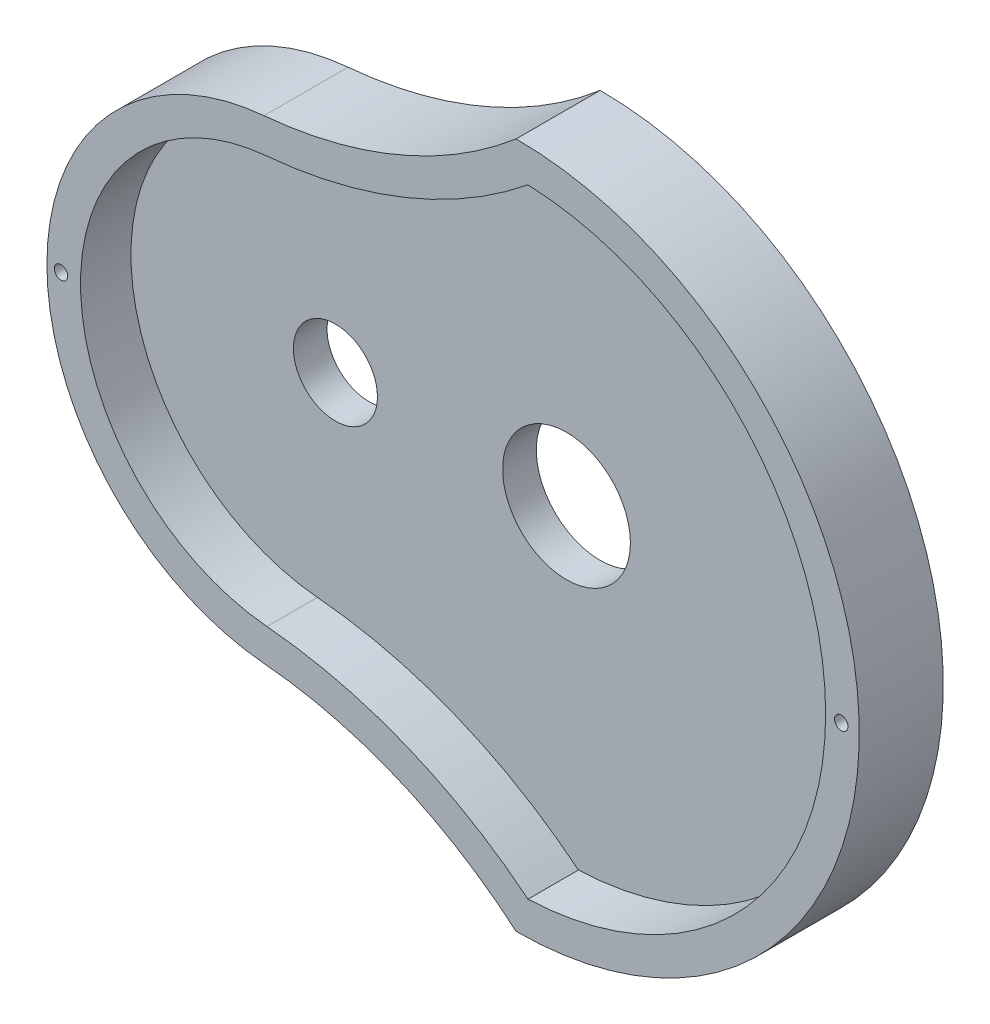
ISO-10303-21;
HEADER;
FILE_DESCRIPTION(('STEP AP214'),'2;1');
FILE_NAME('part.step','',(''),(''),'','','');
FILE_SCHEMA(('AUTOMOTIVE_DESIGN { 1 0 10303 214 1 1 1 1 }'));
ENDSEC;
DATA;
#1=APPLICATION_CONTEXT('core data for automotive mechanical design processes');
#2=APPLICATION_PROTOCOL_DEFINITION('international standard','automotive_design',2000,#1);
#3=PRODUCT_CONTEXT('',#1,'mechanical');
#4=PRODUCT('Part','Part','',(#3));
#5=PRODUCT_RELATED_PRODUCT_CATEGORY('part','',(#4));
#6=PRODUCT_DEFINITION_FORMATION('','',#4);
#7=PRODUCT_DEFINITION_CONTEXT('part definition',#1,'design');
#8=PRODUCT_DEFINITION('design','',#6,#7);
#9=PRODUCT_DEFINITION_SHAPE('','',#8);
#10=(LENGTH_UNIT() NAMED_UNIT(*) SI_UNIT(.MILLI.,.METRE.));
#11=(NAMED_UNIT(*) PLANE_ANGLE_UNIT() SI_UNIT($,.RADIAN.));
#12=(NAMED_UNIT(*) SI_UNIT($,.STERADIAN.) SOLID_ANGLE_UNIT());
#13=UNCERTAINTY_MEASURE_WITH_UNIT(LENGTH_MEASURE(1.E-05),#10,'distance_accuracy_value','');
#14=(GEOMETRIC_REPRESENTATION_CONTEXT(3) GLOBAL_UNCERTAINTY_ASSIGNED_CONTEXT((#13)) GLOBAL_UNIT_ASSIGNED_CONTEXT((#10,
#11,#12)) REPRESENTATION_CONTEXT('',''));
#15=CARTESIAN_POINT('',(0.,0.,0.));
#16=DIRECTION('',(0.,0.,1.));
#17=DIRECTION('',(1.,0.,0.));
#18=AXIS2_PLACEMENT_3D('',#15,#16,#17);
#19=CARTESIAN_POINT('',(-22.0423938438775,51.704240700986,6.35));
#20=DIRECTION('',(0.,0.,-1.));
#21=DIRECTION('',(-1.,0.,0.));
#22=AXIS2_PLACEMENT_3D('',#19,#20,#21);
#23=CYLINDRICAL_SURFACE('',#22,33.9145948689712);
#24=CARTESIAN_POINT('',(-22.0423938438775,51.704240700986,0.));
#25=DIRECTION('',(0.,0.,-1.));
#26=DIRECTION('',(1.,0.,0.));
#27=AXIS2_PLACEMENT_3D('',#24,#25,#26);
#28=CIRCLE('',#27,33.9145948689712);
#29=CARTESIAN_POINT('',(0.,25.92959,0.));
#30=VERTEX_POINT('',#29);
#31=CARTESIAN_POINT('',(-19.05,17.9219180423888,0.));
#32=VERTEX_POINT('',#31);
#33=EDGE_CURVE('E160',#30,#32,#28,.T.);
#34=ORIENTED_EDGE('',*,*,#33,.T.);
#35=DIRECTION('',(0.,0.,-1.));
#36=VECTOR('',#35,1.);
#37=CARTESIAN_POINT('',(-19.05,17.9219180423888,6.35));
#38=LINE('',#37,#36);
#39=CARTESIAN_POINT('',(-19.05,17.9219180423888,6.35));
#40=VERTEX_POINT('',#39);
#41=EDGE_CURVE('E11',#40,#32,#38,.T.);
#42=ORIENTED_EDGE('',*,*,#41,.F.);
#43=CARTESIAN_POINT('',(-22.0423938438775,51.704240700986,6.35));
#44=DIRECTION('',(0.,0.,-1.));
#45=DIRECTION('',(1.,0.,0.));
#46=AXIS2_PLACEMENT_3D('',#43,#44,#45);
#47=CIRCLE('',#46,33.9145948689712);
#48=CARTESIAN_POINT('',(0.,25.92959,6.35));
#49=VERTEX_POINT('',#48);
#50=EDGE_CURVE('E147',#49,#40,#47,.T.);
#51=ORIENTED_EDGE('',*,*,#50,.F.);
#52=DIRECTION('',(0.,0.,-1.));
#53=VECTOR('',#52,1.);
#54=CARTESIAN_POINT('',(0.,25.92959,6.35));
#55=LINE('',#54,#53);
#56=EDGE_CURVE('E156',#49,#30,#55,.T.);
#57=ORIENTED_EDGE('',*,*,#56,.T.);
#58=EDGE_LOOP('',(#34,#42,#51,#57));
#59=FACE_BOUND('',#58,.T.);
#60=ADVANCED_FACE('F43',(#59),#23,.F.);
#61=CARTESIAN_POINT('',(-17.4625,0.,6.35));
#62=DIRECTION('',(0.,0.,-1.));
#63=DIRECTION('',(-1.,0.,0.));
#64=AXIS2_PLACEMENT_3D('',#61,#62,#63);
#65=CYLINDRICAL_SURFACE('',#64,17.99209);
#66=CARTESIAN_POINT('',(-17.4625,0.,0.));
#67=DIRECTION('',(0.,0.,1.));
#68=DIRECTION('',(1.,0.,0.));
#69=AXIS2_PLACEMENT_3D('',#66,#67,#68);
#70=CIRCLE('',#69,17.99209);
#71=CARTESIAN_POINT('',(-19.05,-17.9219180423888,0.));
#72=VERTEX_POINT('',#71);
#73=EDGE_CURVE('E159',#32,#72,#70,.T.);
#74=ORIENTED_EDGE('',*,*,#73,.T.);
#75=DIRECTION('',(0.,0.,-1.));
#76=VECTOR('',#75,1.);
#77=CARTESIAN_POINT('',(-19.05,-17.9219180423888,6.35));
#78=LINE('',#77,#76);
#79=CARTESIAN_POINT('',(-19.05,-17.9219180423888,6.35));
#80=VERTEX_POINT('',#79);
#81=EDGE_CURVE('E49',#80,#72,#78,.T.);
#82=ORIENTED_EDGE('',*,*,#81,.F.);
#83=CARTESIAN_POINT('',(-17.4625,0.,6.35));
#84=DIRECTION('',(0.,0.,1.));
#85=DIRECTION('',(1.,0.,0.));
#86=AXIS2_PLACEMENT_3D('',#83,#84,#85);
#87=CIRCLE('',#86,17.99209);
#88=EDGE_CURVE('E94',#40,#80,#87,.T.);
#89=ORIENTED_EDGE('',*,*,#88,.F.);
#90=ORIENTED_EDGE('',*,*,#41,.T.);
#91=EDGE_LOOP('',(#74,#82,#89,#90));
#92=FACE_BOUND('',#91,.T.);
#93=ADVANCED_FACE('F189',(#92),#65,.T.);
#94=CARTESIAN_POINT('',(-22.0423938438776,-51.7042407009861,6.35));
#95=DIRECTION('',(0.,0.,-1.));
#96=DIRECTION('',(-1.,0.,0.));
#97=AXIS2_PLACEMENT_3D('',#94,#95,#96);
#98=CYLINDRICAL_SURFACE('',#97,33.9145948689713);
#99=CARTESIAN_POINT('',(-22.0423938438776,-51.7042407009861,0.));
#100=DIRECTION('',(0.,0.,-1.));
#101=DIRECTION('',(-1.,0.,0.));
#102=AXIS2_PLACEMENT_3D('',#99,#100,#101);
#103=CIRCLE('',#102,33.9145948689713);
#104=CARTESIAN_POINT('',(0.,-25.92959,0.));
#105=VERTEX_POINT('',#104);
#106=EDGE_CURVE('E165',#72,#105,#103,.T.);
#107=ORIENTED_EDGE('',*,*,#106,.T.);
#108=DIRECTION('',(0.,0.,-1.));
#109=VECTOR('',#108,1.);
#110=CARTESIAN_POINT('',(0.,-25.92959,6.35));
#111=LINE('',#110,#109);
#112=CARTESIAN_POINT('',(0.,-25.92959,6.35));
#113=VERTEX_POINT('',#112);
#114=EDGE_CURVE('E167',#113,#105,#111,.T.);
#115=ORIENTED_EDGE('',*,*,#114,.F.);
#116=CARTESIAN_POINT('',(-22.0423938438776,-51.7042407009861,6.35));
#117=DIRECTION('',(0.,0.,-1.));
#118=DIRECTION('',(-1.,0.,0.));
#119=AXIS2_PLACEMENT_3D('',#116,#117,#118);
#120=CIRCLE('',#119,33.9145948689713);
#121=EDGE_CURVE('E153',#80,#113,#120,.T.);
#122=ORIENTED_EDGE('',*,*,#121,.F.);
#123=ORIENTED_EDGE('',*,*,#81,.T.);
#124=EDGE_LOOP('',(#107,#115,#122,#123));
#125=FACE_BOUND('',#124,.T.);
#126=ADVANCED_FACE('F173',(#125),#98,.F.);
#127=CARTESIAN_POINT('',(0.,0.,6.35));
#128=DIRECTION('',(0.,0.,-1.));
#129=DIRECTION('',(-1.,0.,0.));
#130=AXIS2_PLACEMENT_3D('',#127,#128,#129);
#131=CYLINDRICAL_SURFACE('',#130,25.92959);
#132=CARTESIAN_POINT('',(0.,0.,0.));
#133=DIRECTION('',(0.,0.,1.));
#134=DIRECTION('',(1.,0.,0.));
#135=AXIS2_PLACEMENT_3D('',#132,#133,#134);
#136=CIRCLE('',#135,25.92959);
#137=EDGE_CURVE('E87',#105,#30,#136,.T.);
#138=ORIENTED_EDGE('',*,*,#137,.T.);
#139=ORIENTED_EDGE('',*,*,#56,.F.);
#140=CARTESIAN_POINT('',(0.,0.,6.35));
#141=DIRECTION('',(0.,0.,1.));
#142=DIRECTION('',(1.,0.,0.));
#143=AXIS2_PLACEMENT_3D('',#140,#141,#142);
#144=CIRCLE('',#143,25.92959);
#145=EDGE_CURVE('E68',#113,#49,#144,.T.);
#146=ORIENTED_EDGE('',*,*,#145,.F.);
#147=ORIENTED_EDGE('',*,*,#114,.T.);
#148=EDGE_LOOP('',(#138,#139,#146,#147));
#149=FACE_BOUND('',#148,.T.);
#150=ADVANCED_FACE('F179',(#149),#131,.T.);
#151=CARTESIAN_POINT('',(-11.0211969219388,25.852120350493,6.35));
#152=DIRECTION('',(0.,0.,1.));
#153=DIRECTION('',(1.,0.,0.));
#154=AXIS2_PLACEMENT_3D('',#151,#152,#153);
#155=PLANE('',#154);
#156=CARTESIAN_POINT('',(-34.3926840398212,0.,6.35));
#157=DIRECTION('',(0.,0.,1.));
#158=DIRECTION('',(1.,0.,0.));
#159=AXIS2_PLACEMENT_3D('',#156,#157,#158);
#160=CIRCLE('',#159,0.508000000000002);
#161=CARTESIAN_POINT('',(-33.8846840398212,0.,6.35));
#162=VERTEX_POINT('',#161);
#163=EDGE_CURVE('E334',#162,#162,#160,.T.);
#164=ORIENTED_EDGE('',*,*,#163,.F.);
#165=EDGE_LOOP('',(#164));
#166=FACE_BOUND('',#165,.T.);
#167=CARTESIAN_POINT('',(24.5691431426945,0.,6.35));
#168=DIRECTION('',(0.,0.,1.));
#169=DIRECTION('',(1.,0.,0.));
#170=AXIS2_PLACEMENT_3D('',#167,#168,#169);
#171=CIRCLE('',#170,0.508000000000002);
#172=CARTESIAN_POINT('',(25.0771431426945,0.,6.35));
#173=VERTEX_POINT('',#172);
#174=EDGE_CURVE('E337',#173,#173,#171,.T.);
#175=ORIENTED_EDGE('',*,*,#174,.F.);
#176=EDGE_LOOP('',(#175));
#177=FACE_BOUND('',#176,.T.);
#178=CARTESIAN_POINT('',(-22.0423938438775,51.704240700986,6.35));
#179=DIRECTION('',(0.,0.,1.));
#180=DIRECTION('',(1.,0.,0.));
#181=AXIS2_PLACEMENT_3D('',#178,#179,#180);
#182=CIRCLE('',#181,36.4545948689712);
#183=CARTESIAN_POINT('',(0.897573632694142,23.3723614969047,6.35));
#184=VERTEX_POINT('',#183);
#185=CARTESIAN_POINT('',(-18.8258876261735,15.3918244386069,6.35));
#186=VERTEX_POINT('',#185);
#187=EDGE_CURVE('E139',#184,#186,#182,.F.);
#188=ORIENTED_EDGE('',*,*,#187,.F.);
#189=CARTESIAN_POINT('',(0.,0.,6.35));
#190=DIRECTION('',(0.,0.,1.));
#191=DIRECTION('',(1.,0.,0.));
#192=AXIS2_PLACEMENT_3D('',#189,#190,#191);
#193=CIRCLE('',#192,23.38959);
#194=CARTESIAN_POINT('',(0.897573632694144,-23.3723614969047,6.35));
#195=VERTEX_POINT('',#194);
#196=EDGE_CURVE('E146',#195,#184,#193,.T.);
#197=ORIENTED_EDGE('',*,*,#196,.F.);
#198=CARTESIAN_POINT('',(-22.0423938438776,-51.7042407009861,6.35));
#199=DIRECTION('',(0.,0.,1.));
#200=DIRECTION('',(1.,0.,0.));
#201=AXIS2_PLACEMENT_3D('',#198,#199,#200);
#202=CIRCLE('',#201,36.4545948689713);
#203=CARTESIAN_POINT('',(-18.8258876261735,-15.3918244386069,6.35));
#204=VERTEX_POINT('',#203);
#205=EDGE_CURVE('E148',#204,#195,#202,.F.);
#206=ORIENTED_EDGE('',*,*,#205,.F.);
#207=CARTESIAN_POINT('',(-17.4625,0.,6.35));
#208=DIRECTION('',(0.,0.,1.));
#209=DIRECTION('',(1.,0.,0.));
#210=AXIS2_PLACEMENT_3D('',#207,#208,#209);
#211=CIRCLE('',#210,15.45209);
#212=EDGE_CURVE('E133',#186,#204,#211,.T.);
#213=ORIENTED_EDGE('',*,*,#212,.F.);
#214=EDGE_LOOP('',(#188,#197,#206,#213));
#215=FACE_BOUND('',#214,.T.);
#216=ORIENTED_EDGE('',*,*,#50,.T.);
#217=ORIENTED_EDGE('',*,*,#88,.T.);
#218=ORIENTED_EDGE('',*,*,#121,.T.);
#219=ORIENTED_EDGE('',*,*,#145,.T.);
#220=EDGE_LOOP('',(#216,#217,#218,#219));
#221=FACE_BOUND('',#220,.T.);
#222=ADVANCED_FACE('F182',(#166,#177,#215,#221),#155,.T.);
#223=CARTESIAN_POINT('',(-11.0211969219388,25.852120350493,0.));
#224=DIRECTION('',(0.,0.,1.));
#225=DIRECTION('',(1.,0.,0.));
#226=AXIS2_PLACEMENT_3D('',#223,#224,#225);
#227=PLANE('',#226);
#228=CARTESIAN_POINT('',(0.,0.,0.));
#229=DIRECTION('',(0.,0.,1.));
#230=DIRECTION('',(1.,0.,0.));
#231=AXIS2_PLACEMENT_3D('',#228,#229,#230);
#232=CIRCLE('',#231,4.826);
#233=CARTESIAN_POINT('',(4.826,0.,0.));
#234=VERTEX_POINT('',#233);
#235=EDGE_CURVE('E348',#234,#234,#232,.F.);
#236=ORIENTED_EDGE('',*,*,#235,.F.);
#237=EDGE_LOOP('',(#236));
#238=FACE_BOUND('',#237,.T.);
#239=CARTESIAN_POINT('',(-17.4625,0.,0.));
#240=DIRECTION('',(0.,0.,1.));
#241=DIRECTION('',(1.,0.,0.));
#242=AXIS2_PLACEMENT_3D('',#239,#240,#241);
#243=CIRCLE('',#242,3.175);
#244=CARTESIAN_POINT('',(-14.2875,0.,0.));
#245=VERTEX_POINT('',#244);
#246=EDGE_CURVE('E335',#245,#245,#243,.F.);
#247=ORIENTED_EDGE('',*,*,#246,.F.);
#248=EDGE_LOOP('',(#247));
#249=FACE_BOUND('',#248,.T.);
#250=ORIENTED_EDGE('',*,*,#33,.F.);
#251=ORIENTED_EDGE('',*,*,#137,.F.);
#252=ORIENTED_EDGE('',*,*,#106,.F.);
#253=ORIENTED_EDGE('',*,*,#73,.F.);
#254=EDGE_LOOP('',(#250,#251,#252,#253));
#255=FACE_BOUND('',#254,.T.);
#256=ADVANCED_FACE('F174',(#238,#249,#255),#227,.F.);
#257=CARTESIAN_POINT('',(-22.0423938438775,51.704240700986,6.35));
#258=DIRECTION('',(0.,0.,-1.));
#259=DIRECTION('',(-1.,0.,0.));
#260=AXIS2_PLACEMENT_3D('',#257,#258,#259);
#261=CYLINDRICAL_SURFACE('',#260,36.4545948689712);
#262=CARTESIAN_POINT('',(-22.0423938438775,51.704240700986,2.54));
#263=DIRECTION('',(0.,0.,1.));
#264=DIRECTION('',(1.,0.,0.));
#265=AXIS2_PLACEMENT_3D('',#262,#263,#264);
#266=CIRCLE('',#265,36.4545948689712);
#267=CARTESIAN_POINT('',(0.897573632694142,23.3723614969047,2.54));
#268=VERTEX_POINT('',#267);
#269=CARTESIAN_POINT('',(-18.8258876261735,15.3918244386069,2.54));
#270=VERTEX_POINT('',#269);
#271=EDGE_CURVE('E125',#268,#270,#266,.F.);
#272=ORIENTED_EDGE('',*,*,#271,.F.);
#273=DIRECTION('',(0.,0.,-1.));
#274=VECTOR('',#273,1.);
#275=CARTESIAN_POINT('',(0.897573632694142,23.3723614969047,6.35));
#276=LINE('',#275,#274);
#277=EDGE_CURVE('E142',#184,#268,#276,.T.);
#278=ORIENTED_EDGE('',*,*,#277,.F.);
#279=ORIENTED_EDGE('',*,*,#187,.T.);
#280=DIRECTION('',(0.,0.,-1.));
#281=VECTOR('',#280,1.);
#282=CARTESIAN_POINT('',(-18.8258876261735,15.3918244386069,6.35));
#283=LINE('',#282,#281);
#284=EDGE_CURVE('E132',#186,#270,#283,.T.);
#285=ORIENTED_EDGE('',*,*,#284,.T.);
#286=EDGE_LOOP('',(#272,#278,#279,#285));
#287=FACE_BOUND('',#286,.T.);
#288=ADVANCED_FACE('F228',(#287),#261,.T.);
#289=CARTESIAN_POINT('',(-17.4625,0.,6.35));
#290=DIRECTION('',(0.,0.,-1.));
#291=DIRECTION('',(-1.,0.,0.));
#292=AXIS2_PLACEMENT_3D('',#289,#290,#291);
#293=CYLINDRICAL_SURFACE('',#292,15.45209);
#294=CARTESIAN_POINT('',(-17.4625,0.,2.54));
#295=DIRECTION('',(0.,0.,1.));
#296=DIRECTION('',(1.,0.,0.));
#297=AXIS2_PLACEMENT_3D('',#294,#295,#296);
#298=CIRCLE('',#297,15.45209);
#299=CARTESIAN_POINT('',(-18.8258876261735,-15.3918244386069,2.54));
#300=VERTEX_POINT('',#299);
#301=EDGE_CURVE('E118',#270,#300,#298,.T.);
#302=ORIENTED_EDGE('',*,*,#301,.F.);
#303=ORIENTED_EDGE('',*,*,#284,.F.);
#304=ORIENTED_EDGE('',*,*,#212,.T.);
#305=DIRECTION('',(0.,0.,-1.));
#306=VECTOR('',#305,1.);
#307=CARTESIAN_POINT('',(-18.8258876261735,-15.3918244386069,6.35));
#308=LINE('',#307,#306);
#309=EDGE_CURVE('E126',#204,#300,#308,.T.);
#310=ORIENTED_EDGE('',*,*,#309,.T.);
#311=EDGE_LOOP('',(#302,#303,#304,#310));
#312=FACE_BOUND('',#311,.T.);
#313=ADVANCED_FACE('F129',(#312),#293,.F.);
#314=CARTESIAN_POINT('',(-22.0423938438776,-51.7042407009861,6.35));
#315=DIRECTION('',(0.,0.,-1.));
#316=DIRECTION('',(-1.,0.,0.));
#317=AXIS2_PLACEMENT_3D('',#314,#315,#316);
#318=CYLINDRICAL_SURFACE('',#317,36.4545948689713);
#319=CARTESIAN_POINT('',(-22.0423938438776,-51.7042407009861,2.54));
#320=DIRECTION('',(0.,0.,1.));
#321=DIRECTION('',(1.,0.,0.));
#322=AXIS2_PLACEMENT_3D('',#319,#320,#321);
#323=CIRCLE('',#322,36.4545948689713);
#324=CARTESIAN_POINT('',(0.897573632694144,-23.3723614969047,2.54));
#325=VERTEX_POINT('',#324);
#326=EDGE_CURVE('E119',#300,#325,#323,.F.);
#327=ORIENTED_EDGE('',*,*,#326,.F.);
#328=ORIENTED_EDGE('',*,*,#309,.F.);
#329=ORIENTED_EDGE('',*,*,#205,.T.);
#330=DIRECTION('',(0.,0.,-1.));
#331=VECTOR('',#330,1.);
#332=CARTESIAN_POINT('',(0.897573632694144,-23.3723614969047,6.35));
#333=LINE('',#332,#331);
#334=EDGE_CURVE('E60',#195,#325,#333,.T.);
#335=ORIENTED_EDGE('',*,*,#334,.T.);
#336=EDGE_LOOP('',(#327,#328,#329,#335));
#337=FACE_BOUND('',#336,.T.);
#338=ADVANCED_FACE('F138',(#337),#318,.T.);
#339=CARTESIAN_POINT('',(0.,0.,6.35));
#340=DIRECTION('',(0.,0.,-1.));
#341=DIRECTION('',(-1.,0.,0.));
#342=AXIS2_PLACEMENT_3D('',#339,#340,#341);
#343=CYLINDRICAL_SURFACE('',#342,23.38959);
#344=CARTESIAN_POINT('',(0.,0.,2.54));
#345=DIRECTION('',(0.,0.,1.));
#346=DIRECTION('',(1.,0.,0.));
#347=AXIS2_PLACEMENT_3D('',#344,#345,#346);
#348=CIRCLE('',#347,23.38959);
#349=EDGE_CURVE('E140',#325,#268,#348,.T.);
#350=ORIENTED_EDGE('',*,*,#349,.F.);
#351=ORIENTED_EDGE('',*,*,#334,.F.);
#352=ORIENTED_EDGE('',*,*,#196,.T.);
#353=ORIENTED_EDGE('',*,*,#277,.T.);
#354=EDGE_LOOP('',(#350,#351,#352,#353));
#355=FACE_BOUND('',#354,.T.);
#356=ADVANCED_FACE('F251',(#355),#343,.F.);
#357=CARTESIAN_POINT('',(-11.0211969219388,25.852120350493,2.54));
#358=DIRECTION('',(0.,0.,1.));
#359=DIRECTION('',(1.,0.,0.));
#360=AXIS2_PLACEMENT_3D('',#357,#358,#359);
#361=PLANE('',#360);
#362=CARTESIAN_POINT('',(0.,0.,2.54));
#363=DIRECTION('',(0.,0.,1.));
#364=DIRECTION('',(1.,0.,0.));
#365=AXIS2_PLACEMENT_3D('',#362,#363,#364);
#366=CIRCLE('',#365,4.826);
#367=CARTESIAN_POINT('',(4.826,0.,2.54));
#368=VERTEX_POINT('',#367);
#369=EDGE_CURVE('E350',#368,#368,#366,.T.);
#370=ORIENTED_EDGE('',*,*,#369,.F.);
#371=EDGE_LOOP('',(#370));
#372=FACE_BOUND('',#371,.T.);
#373=CARTESIAN_POINT('',(-17.4625,0.,2.54));
#374=DIRECTION('',(0.,0.,1.));
#375=DIRECTION('',(1.,0.,0.));
#376=AXIS2_PLACEMENT_3D('',#373,#374,#375);
#377=CIRCLE('',#376,3.175);
#378=CARTESIAN_POINT('',(-14.2875,0.,2.54));
#379=VERTEX_POINT('',#378);
#380=EDGE_CURVE('E338',#379,#379,#377,.T.);
#381=ORIENTED_EDGE('',*,*,#380,.F.);
#382=EDGE_LOOP('',(#381));
#383=FACE_BOUND('',#382,.T.);
#384=ORIENTED_EDGE('',*,*,#271,.T.);
#385=ORIENTED_EDGE('',*,*,#301,.T.);
#386=ORIENTED_EDGE('',*,*,#326,.T.);
#387=ORIENTED_EDGE('',*,*,#349,.T.);
#388=EDGE_LOOP('',(#384,#385,#386,#387));
#389=FACE_BOUND('',#388,.T.);
#390=ADVANCED_FACE('F116',(#372,#383,#389),#361,.T.);
#391=CARTESIAN_POINT('',(-17.4625,0.,-13.6499893040251));
#392=DIRECTION('',(0.,0.,1.));
#393=DIRECTION('',(1.,0.,0.));
#394=AXIS2_PLACEMENT_3D('',#391,#392,#393);
#395=CYLINDRICAL_SURFACE('',#394,3.175);
#396=ORIENTED_EDGE('',*,*,#246,.T.);
#397=EDGE_LOOP('',(#396));
#398=FACE_BOUND('',#397,.T.);
#399=ORIENTED_EDGE('',*,*,#380,.T.);
#400=EDGE_LOOP('',(#399));
#401=FACE_BOUND('',#400,.T.);
#402=ADVANCED_FACE('F268',(#398,#401),#395,.F.);
#403=CARTESIAN_POINT('',(0.,0.,-13.6499893040251));
#404=DIRECTION('',(0.,0.,1.));
#405=DIRECTION('',(1.,0.,0.));
#406=AXIS2_PLACEMENT_3D('',#403,#404,#405);
#407=CYLINDRICAL_SURFACE('',#406,4.826);
#408=ORIENTED_EDGE('',*,*,#235,.T.);
#409=EDGE_LOOP('',(#408));
#410=FACE_BOUND('',#409,.T.);
#411=ORIENTED_EDGE('',*,*,#369,.T.);
#412=EDGE_LOOP('',(#411));
#413=FACE_BOUND('',#412,.T.);
#414=ADVANCED_FACE('F279',(#410,#413),#407,.F.);
#415=CARTESIAN_POINT('',(24.5691431426945,0.,5.08));
#416=DIRECTION('',(0.,0.,1.));
#417=DIRECTION('',(1.,0.,0.));
#418=AXIS2_PLACEMENT_3D('',#415,#416,#417);
#419=CYLINDRICAL_SURFACE('',#418,0.508000000000002);
#420=CARTESIAN_POINT('',(24.5691431426945,0.,5.08));
#421=DIRECTION('',(0.,0.,1.));
#422=DIRECTION('',(1.,0.,0.));
#423=AXIS2_PLACEMENT_3D('',#420,#421,#422);
#424=CIRCLE('',#423,0.508000000000002);
#425=CARTESIAN_POINT('',(25.0771431426945,0.,5.08));
#426=VERTEX_POINT('',#425);
#427=EDGE_CURVE('E344',#426,#426,#424,.T.);
#428=ORIENTED_EDGE('',*,*,#427,.F.);
#429=EDGE_LOOP('',(#428));
#430=FACE_BOUND('',#429,.T.);
#431=ORIENTED_EDGE('',*,*,#174,.T.);
#432=EDGE_LOOP('',(#431));
#433=FACE_BOUND('',#432,.T.);
#434=ADVANCED_FACE('F290',(#430,#433),#419,.F.);
#435=CARTESIAN_POINT('',(24.5691431426945,0.,5.08));
#436=DIRECTION('',(0.,0.,1.));
#437=DIRECTION('',(1.,0.,0.));
#438=AXIS2_PLACEMENT_3D('',#435,#436,#437);
#439=PLANE('',#438);
#440=ORIENTED_EDGE('',*,*,#427,.T.);
#441=EDGE_LOOP('',(#440));
#442=FACE_BOUND('',#441,.T.);
#443=ADVANCED_FACE('F298',(#442),#439,.T.);
#444=CARTESIAN_POINT('',(-34.3926840398212,0.,5.08));
#445=DIRECTION('',(0.,0.,1.));
#446=DIRECTION('',(1.,0.,0.));
#447=AXIS2_PLACEMENT_3D('',#444,#445,#446);
#448=CYLINDRICAL_SURFACE('',#447,0.508000000000002);
#449=CARTESIAN_POINT('',(-34.3926840398212,0.,5.08));
#450=DIRECTION('',(0.,0.,1.));
#451=DIRECTION('',(1.,0.,0.));
#452=AXIS2_PLACEMENT_3D('',#449,#450,#451);
#453=CIRCLE('',#452,0.508000000000002);
#454=CARTESIAN_POINT('',(-33.8846840398212,0.,5.08));
#455=VERTEX_POINT('',#454);
#456=EDGE_CURVE('E332',#455,#455,#453,.T.);
#457=ORIENTED_EDGE('',*,*,#456,.F.);
#458=EDGE_LOOP('',(#457));
#459=FACE_BOUND('',#458,.T.);
#460=ORIENTED_EDGE('',*,*,#163,.T.);
#461=EDGE_LOOP('',(#460));
#462=FACE_BOUND('',#461,.T.);
#463=ADVANCED_FACE('F308',(#459,#462),#448,.F.);
#464=CARTESIAN_POINT('',(-34.3926840398212,0.,5.08));
#465=DIRECTION('',(0.,0.,1.));
#466=DIRECTION('',(1.,0.,0.));
#467=AXIS2_PLACEMENT_3D('',#464,#465,#466);
#468=PLANE('',#467);
#469=ORIENTED_EDGE('',*,*,#456,.T.);
#470=EDGE_LOOP('',(#469));
#471=FACE_BOUND('',#470,.T.);
#472=ADVANCED_FACE('F316',(#471),#468,.T.);
#473=CLOSED_SHELL('',(#60,#93,#126,#150,#222,#256,#288,#313,#338,#356,#390,#402,#414,#434,#443,
#463,#472));
#474=MANIFOLD_SOLID_BREP('B2',#473);
#475=ADVANCED_BREP_SHAPE_REPRESENTATION('',(#18,#474),#14);
#476=SHAPE_DEFINITION_REPRESENTATION(#9,#475);
ENDSEC;
END-ISO-10303-21;
